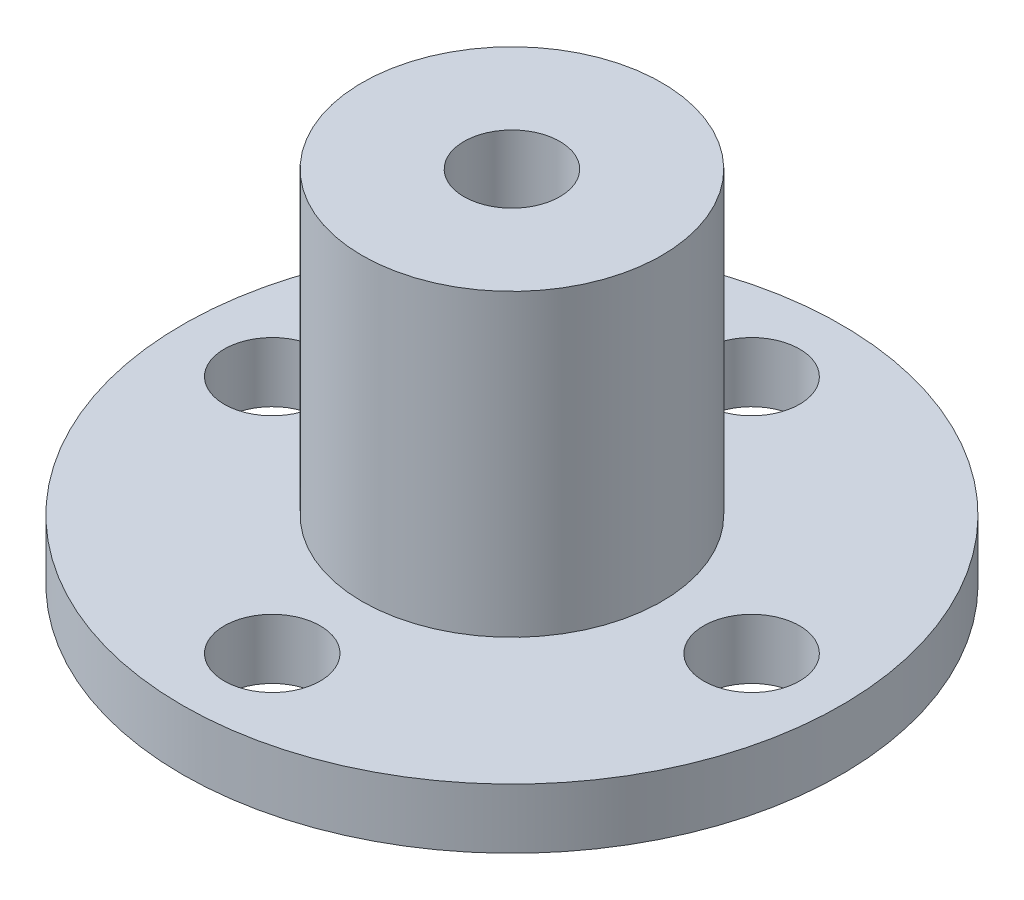
ISO-10303-21;
HEADER;
FILE_DESCRIPTION(('STEP AP214'),'2;1');
FILE_NAME('part.step','',(''),(''),'','','');
FILE_SCHEMA(('AUTOMOTIVE_DESIGN { 1 0 10303 214 1 1 1 1 }'));
ENDSEC;
DATA;
#1=APPLICATION_CONTEXT('core data for automotive mechanical design processes');
#2=APPLICATION_PROTOCOL_DEFINITION('international standard','automotive_design',2000,#1);
#3=PRODUCT_CONTEXT('',#1,'mechanical');
#4=PRODUCT('Part','Part','',(#3));
#5=PRODUCT_RELATED_PRODUCT_CATEGORY('part','',(#4));
#6=PRODUCT_DEFINITION_FORMATION('','',#4);
#7=PRODUCT_DEFINITION_CONTEXT('part definition',#1,'design');
#8=PRODUCT_DEFINITION('design','',#6,#7);
#9=PRODUCT_DEFINITION_SHAPE('','',#8);
#10=(LENGTH_UNIT() NAMED_UNIT(*) SI_UNIT(.MILLI.,.METRE.));
#11=(NAMED_UNIT(*) PLANE_ANGLE_UNIT() SI_UNIT($,.RADIAN.));
#12=(NAMED_UNIT(*) SI_UNIT($,.STERADIAN.) SOLID_ANGLE_UNIT());
#13=UNCERTAINTY_MEASURE_WITH_UNIT(LENGTH_MEASURE(1.E-05),#10,'distance_accuracy_value','');
#14=(GEOMETRIC_REPRESENTATION_CONTEXT(3) GLOBAL_UNCERTAINTY_ASSIGNED_CONTEXT((#13)) GLOBAL_UNIT_ASSIGNED_CONTEXT((#10,
#11,#12)) REPRESENTATION_CONTEXT('',''));
#15=CARTESIAN_POINT('',(0.,0.,0.));
#16=DIRECTION('',(0.,0.,1.));
#17=DIRECTION('',(1.,0.,0.));
#18=AXIS2_PLACEMENT_3D('',#15,#16,#17);
#19=CARTESIAN_POINT('',(-8.,-2.,0.));
#20=DIRECTION('',(0.,1.,0.));
#21=DIRECTION('',(0.,0.,1.));
#22=AXIS2_PLACEMENT_3D('',#19,#20,#21);
#23=CYLINDRICAL_SURFACE('',#22,1.6);
#24=CARTESIAN_POINT('',(-8.,0.,0.));
#25=DIRECTION('',(0.,1.,0.));
#26=DIRECTION('',(0.,0.,1.));
#27=AXIS2_PLACEMENT_3D('',#24,#25,#26);
#28=CIRCLE('',#27,1.6);
#29=CARTESIAN_POINT('',(-8.,0.,1.6));
#30=VERTEX_POINT('',#29);
#31=EDGE_CURVE('E65',#30,#30,#28,.T.);
#32=ORIENTED_EDGE('',*,*,#31,.T.);
#33=EDGE_LOOP('',(#32));
#34=FACE_BOUND('',#33,.T.);
#35=CARTESIAN_POINT('',(-8.,-2.,0.));
#36=DIRECTION('',(0.,1.,0.));
#37=DIRECTION('',(0.,0.,1.));
#38=AXIS2_PLACEMENT_3D('',#35,#36,#37);
#39=CIRCLE('',#38,1.6);
#40=CARTESIAN_POINT('',(-8.,-2.,1.6));
#41=VERTEX_POINT('',#40);
#42=EDGE_CURVE('E80',#41,#41,#39,.T.);
#43=ORIENTED_EDGE('',*,*,#42,.F.);
#44=EDGE_LOOP('',(#43));
#45=FACE_BOUND('',#44,.T.);
#46=ADVANCED_FACE('F45',(#34,#45),#23,.F.);
#47=CARTESIAN_POINT('',(0.,-2.,-8.));
#48=DIRECTION('',(0.,1.,0.));
#49=DIRECTION('',(0.,0.,1.));
#50=AXIS2_PLACEMENT_3D('',#47,#48,#49);
#51=CYLINDRICAL_SURFACE('',#50,1.6);
#52=CARTESIAN_POINT('',(0.,0.,-8.));
#53=DIRECTION('',(0.,1.,0.));
#54=DIRECTION('',(0.,0.,1.));
#55=AXIS2_PLACEMENT_3D('',#52,#53,#54);
#56=CIRCLE('',#55,1.6);
#57=CARTESIAN_POINT('',(0.,0.,-6.4));
#58=VERTEX_POINT('',#57);
#59=EDGE_CURVE('E49',#58,#58,#56,.T.);
#60=ORIENTED_EDGE('',*,*,#59,.T.);
#61=EDGE_LOOP('',(#60));
#62=FACE_BOUND('',#61,.T.);
#63=CARTESIAN_POINT('',(0.,-2.,-8.));
#64=DIRECTION('',(0.,1.,0.));
#65=DIRECTION('',(0.,0.,1.));
#66=AXIS2_PLACEMENT_3D('',#63,#64,#65);
#67=CIRCLE('',#66,1.6);
#68=CARTESIAN_POINT('',(0.,-2.,-6.4));
#69=VERTEX_POINT('',#68);
#70=EDGE_CURVE('E11',#69,#69,#67,.T.);
#71=ORIENTED_EDGE('',*,*,#70,.F.);
#72=EDGE_LOOP('',(#71));
#73=FACE_BOUND('',#72,.T.);
#74=ADVANCED_FACE('F105',(#62,#73),#51,.F.);
#75=CARTESIAN_POINT('',(8.,-2.,0.));
#76=DIRECTION('',(0.,1.,0.));
#77=DIRECTION('',(0.,0.,1.));
#78=AXIS2_PLACEMENT_3D('',#75,#76,#77);
#79=CYLINDRICAL_SURFACE('',#78,1.6);
#80=CARTESIAN_POINT('',(8.,0.,0.));
#81=DIRECTION('',(0.,1.,0.));
#82=DIRECTION('',(0.,0.,1.));
#83=AXIS2_PLACEMENT_3D('',#80,#81,#82);
#84=CIRCLE('',#83,1.6);
#85=CARTESIAN_POINT('',(8.,0.,1.6));
#86=VERTEX_POINT('',#85);
#87=EDGE_CURVE('E71',#86,#86,#84,.T.);
#88=ORIENTED_EDGE('',*,*,#87,.T.);
#89=EDGE_LOOP('',(#88));
#90=FACE_BOUND('',#89,.T.);
#91=CARTESIAN_POINT('',(8.,-2.,0.));
#92=DIRECTION('',(0.,1.,0.));
#93=DIRECTION('',(0.,0.,1.));
#94=AXIS2_PLACEMENT_3D('',#91,#92,#93);
#95=CIRCLE('',#94,1.6);
#96=CARTESIAN_POINT('',(8.,-2.,1.6));
#97=VERTEX_POINT('',#96);
#98=EDGE_CURVE('E53',#97,#97,#95,.T.);
#99=ORIENTED_EDGE('',*,*,#98,.F.);
#100=EDGE_LOOP('',(#99));
#101=FACE_BOUND('',#100,.T.);
#102=ADVANCED_FACE('F97',(#90,#101),#79,.F.);
#103=CARTESIAN_POINT('',(0.,-2.,8.));
#104=DIRECTION('',(0.,1.,0.));
#105=DIRECTION('',(0.,0.,1.));
#106=AXIS2_PLACEMENT_3D('',#103,#104,#105);
#107=CYLINDRICAL_SURFACE('',#106,1.6);
#108=CARTESIAN_POINT('',(0.,0.,8.));
#109=DIRECTION('',(0.,1.,0.));
#110=DIRECTION('',(0.,0.,1.));
#111=AXIS2_PLACEMENT_3D('',#108,#109,#110);
#112=CIRCLE('',#111,1.6);
#113=CARTESIAN_POINT('',(0.,0.,9.6));
#114=VERTEX_POINT('',#113);
#115=EDGE_CURVE('E69',#114,#114,#112,.T.);
#116=ORIENTED_EDGE('',*,*,#115,.T.);
#117=EDGE_LOOP('',(#116));
#118=FACE_BOUND('',#117,.T.);
#119=CARTESIAN_POINT('',(0.,-2.,8.));
#120=DIRECTION('',(0.,1.,0.));
#121=DIRECTION('',(0.,0.,1.));
#122=AXIS2_PLACEMENT_3D('',#119,#120,#121);
#123=CIRCLE('',#122,1.6);
#124=CARTESIAN_POINT('',(0.,-2.,9.6));
#125=VERTEX_POINT('',#124);
#126=EDGE_CURVE('E58',#125,#125,#123,.T.);
#127=ORIENTED_EDGE('',*,*,#126,.F.);
#128=EDGE_LOOP('',(#127));
#129=FACE_BOUND('',#128,.T.);
#130=ADVANCED_FACE('F95',(#118,#129),#107,.F.);
#131=CARTESIAN_POINT('',(0.,-2.,0.));
#132=DIRECTION('',(0.,1.,0.));
#133=DIRECTION('',(0.,0.,1.));
#134=AXIS2_PLACEMENT_3D('',#131,#132,#133);
#135=CYLINDRICAL_SURFACE('',#134,5.);
#136=CARTESIAN_POINT('',(0.,-2.,0.));
#137=DIRECTION('',(0.,1.,0.));
#138=DIRECTION('',(0.,0.,1.));
#139=AXIS2_PLACEMENT_3D('',#136,#137,#138);
#140=CIRCLE('',#139,5.);
#141=CARTESIAN_POINT('',(0.,-2.,5.));
#142=VERTEX_POINT('',#141);
#143=EDGE_CURVE('E76',#142,#142,#140,.T.);
#144=ORIENTED_EDGE('',*,*,#143,.F.);
#145=EDGE_LOOP('',(#144));
#146=FACE_BOUND('',#145,.T.);
#147=CARTESIAN_POINT('',(0.,0.,0.));
#148=DIRECTION('',(0.,1.,0.));
#149=DIRECTION('',(0.,0.,1.));
#150=AXIS2_PLACEMENT_3D('',#147,#148,#149);
#151=CIRCLE('',#150,5.);
#152=CARTESIAN_POINT('',(0.,0.,5.));
#153=VERTEX_POINT('',#152);
#154=EDGE_CURVE('E62',#153,#153,#151,.T.);
#155=ORIENTED_EDGE('',*,*,#154,.T.);
#156=EDGE_LOOP('',(#155));
#157=FACE_BOUND('',#156,.T.);
#158=ADVANCED_FACE('F47',(#146,#157),#135,.F.);
#159=CARTESIAN_POINT('',(0.,-2.,0.));
#160=DIRECTION('',(0.,1.,0.));
#161=DIRECTION('',(0.,0.,1.));
#162=AXIS2_PLACEMENT_3D('',#159,#160,#161);
#163=PLANE('',#162);
#164=ORIENTED_EDGE('',*,*,#126,.T.);
#165=EDGE_LOOP('',(#164));
#166=FACE_BOUND('',#165,.T.);
#167=ORIENTED_EDGE('',*,*,#98,.T.);
#168=EDGE_LOOP('',(#167));
#169=FACE_BOUND('',#168,.T.);
#170=ORIENTED_EDGE('',*,*,#70,.T.);
#171=EDGE_LOOP('',(#170));
#172=FACE_BOUND('',#171,.T.);
#173=ORIENTED_EDGE('',*,*,#143,.T.);
#174=EDGE_LOOP('',(#173));
#175=FACE_BOUND('',#174,.T.);
#176=ORIENTED_EDGE('',*,*,#42,.T.);
#177=EDGE_LOOP('',(#176));
#178=FACE_BOUND('',#177,.T.);
#179=CARTESIAN_POINT('',(0.,-2.,0.));
#180=DIRECTION('',(0.,1.,0.));
#181=DIRECTION('',(0.,0.,1.));
#182=AXIS2_PLACEMENT_3D('',#179,#180,#181);
#183=CIRCLE('',#182,11.);
#184=CARTESIAN_POINT('',(0.,-2.,11.));
#185=VERTEX_POINT('',#184);
#186=EDGE_CURVE('E66',#185,#185,#183,.T.);
#187=ORIENTED_EDGE('',*,*,#186,.F.);
#188=EDGE_LOOP('',(#187));
#189=FACE_BOUND('',#188,.T.);
#190=ADVANCED_FACE('F92',(#166,#169,#172,#175,#178,#189),#163,.F.);
#191=CARTESIAN_POINT('',(0.,0.,0.));
#192=DIRECTION('',(0.,1.,0.));
#193=DIRECTION('',(0.,0.,1.));
#194=AXIS2_PLACEMENT_3D('',#191,#192,#193);
#195=PLANE('',#194);
#196=ORIENTED_EDGE('',*,*,#115,.F.);
#197=EDGE_LOOP('',(#196));
#198=FACE_BOUND('',#197,.T.);
#199=ORIENTED_EDGE('',*,*,#87,.F.);
#200=EDGE_LOOP('',(#199));
#201=FACE_BOUND('',#200,.T.);
#202=ORIENTED_EDGE('',*,*,#59,.F.);
#203=EDGE_LOOP('',(#202));
#204=FACE_BOUND('',#203,.T.);
#205=ORIENTED_EDGE('',*,*,#154,.F.);
#206=EDGE_LOOP('',(#205));
#207=FACE_BOUND('',#206,.T.);
#208=ORIENTED_EDGE('',*,*,#31,.F.);
#209=EDGE_LOOP('',(#208));
#210=FACE_BOUND('',#209,.T.);
#211=CARTESIAN_POINT('',(0.,0.,0.));
#212=DIRECTION('',(0.,1.,0.));
#213=DIRECTION('',(0.,0.,1.));
#214=AXIS2_PLACEMENT_3D('',#211,#212,#213);
#215=CIRCLE('',#214,11.);
#216=CARTESIAN_POINT('',(0.,0.,11.));
#217=VERTEX_POINT('',#216);
#218=EDGE_CURVE('E87',#217,#217,#215,.T.);
#219=ORIENTED_EDGE('',*,*,#218,.T.);
#220=EDGE_LOOP('',(#219));
#221=FACE_BOUND('',#220,.T.);
#222=ADVANCED_FACE('F119',(#198,#201,#204,#207,#210,#221),#195,.T.);
#223=CARTESIAN_POINT('',(0.,-2.,0.));
#224=DIRECTION('',(0.,1.,0.));
#225=DIRECTION('',(0.,0.,1.));
#226=AXIS2_PLACEMENT_3D('',#223,#224,#225);
#227=CYLINDRICAL_SURFACE('',#226,11.);
#228=ORIENTED_EDGE('',*,*,#186,.T.);
#229=EDGE_LOOP('',(#228));
#230=FACE_BOUND('',#229,.T.);
#231=ORIENTED_EDGE('',*,*,#218,.F.);
#232=EDGE_LOOP('',(#231));
#233=FACE_BOUND('',#232,.T.);
#234=ADVANCED_FACE('F128',(#230,#233),#227,.T.);
#235=CLOSED_SHELL('',(#46,#74,#102,#130,#158,#190,#222,#234));
#236=MANIFOLD_SOLID_BREP('B2',#235);
#237=CARTESIAN_POINT('',(0.,10.,0.));
#238=DIRECTION('',(0.,-1.,0.));
#239=DIRECTION('',(0.,0.,-1.));
#240=AXIS2_PLACEMENT_3D('',#237,#238,#239);
#241=CYLINDRICAL_SURFACE('',#240,1.6);
#242=CARTESIAN_POINT('',(0.,10.,0.));
#243=DIRECTION('',(0.,1.,0.));
#244=DIRECTION('',(0.,0.,1.));
#245=AXIS2_PLACEMENT_3D('',#242,#243,#244);
#246=CIRCLE('',#245,1.6);
#247=CARTESIAN_POINT('',(0.,10.,1.6));
#248=VERTEX_POINT('',#247);
#249=EDGE_CURVE('E216',#248,#248,#246,.T.);
#250=ORIENTED_EDGE('',*,*,#249,.T.);
#251=EDGE_LOOP('',(#250));
#252=FACE_BOUND('',#251,.T.);
#253=CARTESIAN_POINT('',(0.,0.,0.));
#254=DIRECTION('',(0.,1.,0.));
#255=DIRECTION('',(0.,0.,1.));
#256=AXIS2_PLACEMENT_3D('',#253,#254,#255);
#257=CIRCLE('',#256,1.6);
#258=CARTESIAN_POINT('',(0.,0.,1.6));
#259=VERTEX_POINT('',#258);
#260=EDGE_CURVE('E222',#259,#259,#257,.T.);
#261=ORIENTED_EDGE('',*,*,#260,.F.);
#262=EDGE_LOOP('',(#261));
#263=FACE_BOUND('',#262,.T.);
#264=ADVANCED_FACE('F209',(#252,#263),#241,.F.);
#265=CARTESIAN_POINT('',(0.,10.,0.));
#266=DIRECTION('',(0.,-1.,0.));
#267=DIRECTION('',(0.,0.,-1.));
#268=AXIS2_PLACEMENT_3D('',#265,#266,#267);
#269=CYLINDRICAL_SURFACE('',#268,5.);
#270=CARTESIAN_POINT('',(0.,10.,0.));
#271=DIRECTION('',(0.,1.,0.));
#272=DIRECTION('',(0.,0.,1.));
#273=AXIS2_PLACEMENT_3D('',#270,#271,#272);
#274=CIRCLE('',#273,5.);
#275=CARTESIAN_POINT('',(0.,10.,5.));
#276=VERTEX_POINT('',#275);
#277=EDGE_CURVE('E44',#276,#276,#274,.T.);
#278=ORIENTED_EDGE('',*,*,#277,.F.);
#279=EDGE_LOOP('',(#278));
#280=FACE_BOUND('',#279,.T.);
#281=CARTESIAN_POINT('',(0.,0.,0.));
#282=DIRECTION('',(0.,1.,0.));
#283=DIRECTION('',(0.,0.,1.));
#284=AXIS2_PLACEMENT_3D('',#281,#282,#283);
#285=CIRCLE('',#284,5.);
#286=CARTESIAN_POINT('',(0.,0.,5.));
#287=VERTEX_POINT('',#286);
#288=EDGE_CURVE('E212',#287,#287,#285,.T.);
#289=ORIENTED_EDGE('',*,*,#288,.T.);
#290=EDGE_LOOP('',(#289));
#291=FACE_BOUND('',#290,.T.);
#292=ADVANCED_FACE('F229',(#280,#291),#269,.T.);
#293=CARTESIAN_POINT('',(0.,10.,0.));
#294=DIRECTION('',(0.,1.,0.));
#295=DIRECTION('',(0.,0.,1.));
#296=AXIS2_PLACEMENT_3D('',#293,#294,#295);
#297=PLANE('',#296);
#298=ORIENTED_EDGE('',*,*,#249,.F.);
#299=EDGE_LOOP('',(#298));
#300=FACE_BOUND('',#299,.T.);
#301=ORIENTED_EDGE('',*,*,#277,.T.);
#302=EDGE_LOOP('',(#301));
#303=FACE_BOUND('',#302,.T.);
#304=ADVANCED_FACE('F233',(#300,#303),#297,.T.);
#305=CARTESIAN_POINT('',(0.,0.,0.));
#306=DIRECTION('',(0.,1.,0.));
#307=DIRECTION('',(0.,0.,1.));
#308=AXIS2_PLACEMENT_3D('',#305,#306,#307);
#309=PLANE('',#308);
#310=ORIENTED_EDGE('',*,*,#260,.T.);
#311=EDGE_LOOP('',(#310));
#312=FACE_BOUND('',#311,.T.);
#313=ORIENTED_EDGE('',*,*,#288,.F.);
#314=EDGE_LOOP('',(#313));
#315=FACE_BOUND('',#314,.T.);
#316=ADVANCED_FACE('F231',(#312,#315),#309,.F.);
#317=CLOSED_SHELL('',(#264,#292,#304,#316));
#318=MANIFOLD_SOLID_BREP('B6',#317);
#319=ADVANCED_BREP_SHAPE_REPRESENTATION('',(#18,#236,#318),#14);
#320=SHAPE_DEFINITION_REPRESENTATION(#9,#319);
ENDSEC;
END-ISO-10303-21;
